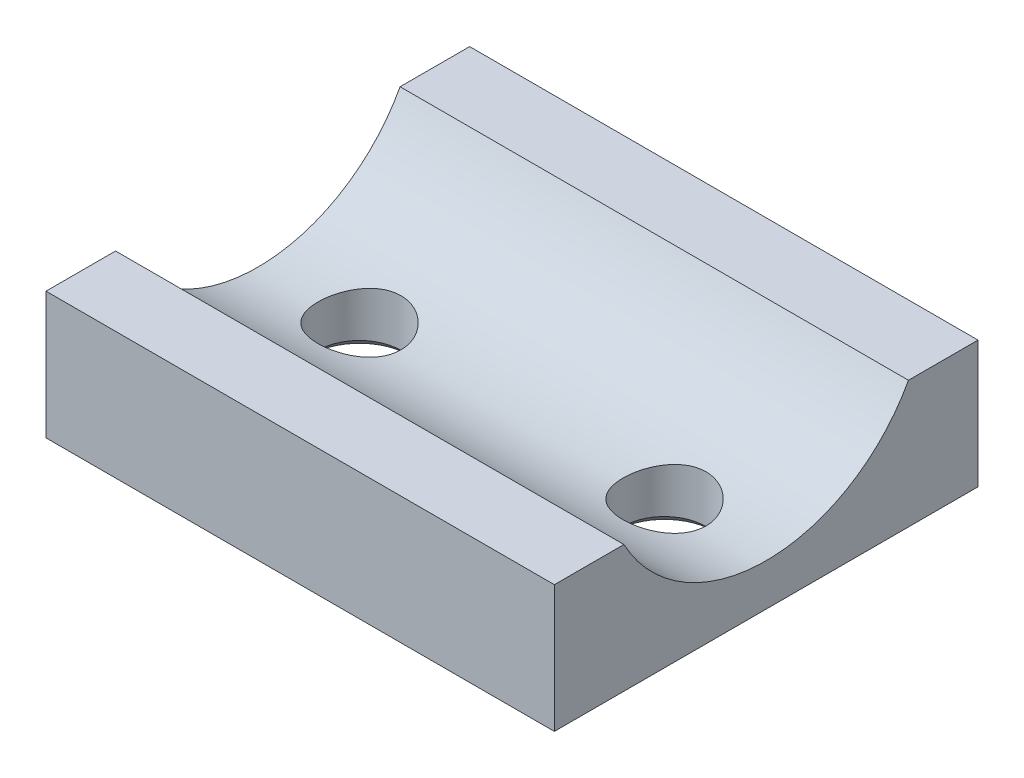
ISO-10303-21;
HEADER;
FILE_DESCRIPTION(('STEP AP214'),'2;1');
FILE_NAME('part.step','',(''),(''),'','','');
FILE_SCHEMA(('AUTOMOTIVE_DESIGN { 1 0 10303 214 1 1 1 1 }'));
ENDSEC;
DATA;
#1=APPLICATION_CONTEXT('core data for automotive mechanical design processes');
#2=APPLICATION_PROTOCOL_DEFINITION('international standard','automotive_design',2000,#1);
#3=PRODUCT_CONTEXT('',#1,'mechanical');
#4=PRODUCT('Part','Part','',(#3));
#5=PRODUCT_RELATED_PRODUCT_CATEGORY('part','',(#4));
#6=PRODUCT_DEFINITION_FORMATION('','',#4);
#7=PRODUCT_DEFINITION_CONTEXT('part definition',#1,'design');
#8=PRODUCT_DEFINITION('design','',#6,#7);
#9=PRODUCT_DEFINITION_SHAPE('','',#8);
#10=(LENGTH_UNIT() NAMED_UNIT(*) SI_UNIT(.MILLI.,.METRE.));
#11=(NAMED_UNIT(*) PLANE_ANGLE_UNIT() SI_UNIT($,.RADIAN.));
#12=(NAMED_UNIT(*) SI_UNIT($,.STERADIAN.) SOLID_ANGLE_UNIT());
#13=UNCERTAINTY_MEASURE_WITH_UNIT(LENGTH_MEASURE(1.E-05),#10,'distance_accuracy_value','');
#14=(GEOMETRIC_REPRESENTATION_CONTEXT(3) GLOBAL_UNCERTAINTY_ASSIGNED_CONTEXT((#13)) GLOBAL_UNIT_ASSIGNED_CONTEXT((#10,
#11,#12)) REPRESENTATION_CONTEXT('',''));
#15=CARTESIAN_POINT('',(0.,0.,0.));
#16=DIRECTION('',(0.,0.,1.));
#17=DIRECTION('',(1.,0.,0.));
#18=AXIS2_PLACEMENT_3D('',#15,#16,#17);
#19=CARTESIAN_POINT('',(15.,0.,0.));
#20=DIRECTION('',(-1.,0.,0.));
#21=DIRECTION('',(0.,0.,1.));
#22=AXIS2_PLACEMENT_3D('',#19,#20,#21);
#23=CYLINDRICAL_SURFACE('',#22,9.525);
#24=CARTESIAN_POINT('',(-9.,-9.20451655438785,-2.45));
#25=CARTESIAN_POINT('',(-9.13515200735814,-9.20451904732069,-2.44999639756066));
#26=CARTESIAN_POINT('',(-9.27034311682223,-9.20752577717406,-2.43877859758642));
#27=CARTESIAN_POINT('',(-9.53683369008053,-9.21919488490305,-2.39428105670851));
#28=CARTESIAN_POINT('',(-9.66813098166102,-9.22786035976253,-2.36098923472384));
#29=CARTESIAN_POINT('',(-9.92294057886931,-9.24980206611432,-2.27350009204487));
#30=CARTESIAN_POINT('',(-10.0464630576719,-9.26307211793909,-2.21933077968247));
#31=CARTESIAN_POINT('',(-10.282683007246,-9.29272000720761,-2.09171069647173));
#32=CARTESIAN_POINT('',(-10.3953798539359,-9.30909802365915,-2.01825881492206));
#33=CARTESIAN_POINT('',(-10.6093734683956,-9.34354353157542,-1.85233097698296));
#34=CARTESIAN_POINT('',(-10.7103809381502,-9.36163929153996,-1.75948771265328));
#35=CARTESIAN_POINT('',(-10.8955761840942,-9.39723665472627,-1.55820323633335));
#36=CARTESIAN_POINT('',(-10.9797623163948,-9.41473819973896,-1.44976050164231));
#37=CARTESIAN_POINT('',(-11.1301184529976,-9.44748908901226,-1.21836318732028));
#38=CARTESIAN_POINT('',(-11.1960028039258,-9.46270118954783,-1.09521726916934));
#39=CARTESIAN_POINT('',(-11.3060254502481,-9.48883590935607,-0.839140919265437));
#40=CARTESIAN_POINT('',(-11.3501671483797,-9.49975919977564,-0.706212022299402));
#41=CARTESIAN_POINT('',(-11.4145207200486,-9.51588568204961,-0.437360648249003));
#42=CARTESIAN_POINT('',(-11.4352242316497,-9.52120622318413,-0.301563013377123));
#43=CARTESIAN_POINT('',(-11.4536584722854,-9.52593723967559,-0.0283247085545592));
#44=CARTESIAN_POINT('',(-11.4513927886676,-9.5253486379274,0.109115701477194));
#45=CARTESIAN_POINT('',(-11.4243034086283,-9.51841445843529,0.378323148050841));
#46=CARTESIAN_POINT('',(-11.4000105967572,-9.51220437217914,0.510147623994009));
#47=CARTESIAN_POINT('',(-11.3304117185846,-9.49488365529906,0.767782232812577));
#48=CARTESIAN_POINT('',(-11.2851044982253,-9.48377275553656,0.893592034958776));
#49=CARTESIAN_POINT('',(-11.1743430677994,-9.45769425643134,1.13700616163227));
#50=CARTESIAN_POINT('',(-11.1087029333973,-9.44269128265499,1.25452193888615));
#51=CARTESIAN_POINT('',(-10.9592806892811,-9.41045144638833,1.4770543914048));
#52=CARTESIAN_POINT('',(-10.8754952596115,-9.39321417533165,1.58206877389471));
#53=CARTESIAN_POINT('',(-10.6893265684424,-9.35779777162174,1.77978485761155));
#54=CARTESIAN_POINT('',(-10.5864797460725,-9.3396058017549,1.87204825844288));
#55=CARTESIAN_POINT('',(-10.3665838077235,-9.30477899259357,2.03811997927798));
#56=CARTESIAN_POINT('',(-10.2495339459965,-9.28814423514372,2.11192732960103));
#57=CARTESIAN_POINT('',(-10.0036563466171,-9.25826690943316,2.23929479759944));
#58=CARTESIAN_POINT('',(-9.87476852402098,-9.24504310927628,2.29274363295592));
#59=CARTESIAN_POINT('',(-9.60941301845891,-9.22372227705825,2.37707490244969));
#60=CARTESIAN_POINT('',(-9.47294707375482,-9.21562407453326,2.40796248884444));
#61=CARTESIAN_POINT('',(-9.20038849045749,-9.20571859876108,2.44555522913943));
#62=CARTESIAN_POINT('',(-9.06439161804943,-9.20374214862286,2.45291089002456));
#63=CARTESIAN_POINT('',(-8.79311247410184,-9.20584244970522,2.44501672448147));
#64=CARTESIAN_POINT('',(-8.65783013376686,-9.2099186071091,2.42976911564301));
#65=CARTESIAN_POINT('',(-8.39427421048786,-9.22350217002365,2.37767295355934));
#66=CARTESIAN_POINT('',(-8.26591927515753,-9.23291296220525,2.34120834988184));
#67=CARTESIAN_POINT('',(-8.01714520757908,-9.25601257682629,2.24814154209332));
#68=CARTESIAN_POINT('',(-7.89672705934488,-9.2697019285239,2.19153684653124));
#69=CARTESIAN_POINT('',(-7.66450329863019,-9.30016859021987,2.05845258217061));
#70=CARTESIAN_POINT('',(-7.55292664794532,-9.31700378526459,1.98158703955528));
#71=CARTESIAN_POINT('',(-7.3440165644333,-9.35172572220855,1.81064694252776));
#72=CARTESIAN_POINT('',(-7.24668562087799,-9.36961264712177,1.71656938696293));
#73=CARTESIAN_POINT('',(-7.06636700069266,-9.4049998574581,1.51088033554449));
#74=CARTESIAN_POINT('',(-6.98383088333506,-9.42247712257714,1.39886825787311));
#75=CARTESIAN_POINT('',(-6.83873726429737,-9.45458400692376,1.16219853533747));
#76=CARTESIAN_POINT('',(-6.77617870748064,-9.46921377652897,1.0375415587857));
#77=CARTESIAN_POINT('',(-6.67337368879721,-9.49388389860037,0.779991865091784));
#78=CARTESIAN_POINT('',(-6.63296371065121,-9.50395778630622,0.647167783542031));
#79=CARTESIAN_POINT('',(-6.57511859051193,-9.5185282562603,0.376318792445267));
#80=CARTESIAN_POINT('',(-6.55767873644625,-9.52302598238662,0.23829495554935));
#81=CARTESIAN_POINT('',(-6.54654689215684,-9.52588754078064,-0.0348035575238239));
#82=CARTESIAN_POINT('',(-6.55219025193782,-9.5244230527255,-0.169849741223865));
#83=CARTESIAN_POINT('',(-6.585533386948,-9.51590865164056,-0.437001631212369));
#84=CARTESIAN_POINT('',(-6.61323243468107,-9.50885892283724,-0.569107434340114));
#85=CARTESIAN_POINT('',(-6.68953573573961,-9.48999595508919,-0.825888525303777));
#86=CARTESIAN_POINT('',(-6.738013524999,-9.47821155913753,-0.950603650238749));
#87=CARTESIAN_POINT('',(-6.85438442036358,-9.45111637079174,-1.1902009017017));
#88=CARTESIAN_POINT('',(-6.92228009594625,-9.43580511175663,-1.305081724287));
#89=CARTESIAN_POINT('',(-7.07755165206016,-9.4028212494833,-1.52487677432985));
#90=CARTESIAN_POINT('',(-7.16537415332756,-9.38509897890205,-1.62946803081194));
#91=CARTESIAN_POINT('',(-7.35714783165512,-9.34950412215302,-1.82265402050461));
#92=CARTESIAN_POINT('',(-7.46110315482277,-9.33163149846463,-1.91124462887626));
#93=CARTESIAN_POINT('',(-7.68470068019195,-9.29734946295689,-2.07166532226688));
#94=CARTESIAN_POINT('',(-7.80461566846157,-9.28097658367948,-2.14312364912729));
#95=CARTESIAN_POINT('',(-8.05516252579463,-9.25204932425484,-2.26476140553189));
#96=CARTESIAN_POINT('',(-8.18578685257367,-9.23949228555909,-2.31495565970033));
#97=CARTESIAN_POINT('',(-8.43006461288035,-9.2214884682937,-2.38554911143939));
#98=CARTESIAN_POINT('',(-8.54259436873599,-9.21517340347899,-2.40966381082372));
#99=CARTESIAN_POINT('',(-8.7700734733828,-9.20668658663812,-2.44189001297891));
#100=CARTESIAN_POINT('',(-8.88502258689412,-9.20451443358347,-2.45000306469112));
#101=CARTESIAN_POINT('',(-9.,-9.20451655438785,-2.45));
#102=B_SPLINE_CURVE_WITH_KNOTS('',3,(#24,#25,#26,#27,#28,#29,#30,#31,#32,#33,#34,#35,#36,#37,
#38,#39,#40,#41,#42,#43,#44,#45,#46,#47,#48,#49,#50,#51,#52,#53,#54,#55,#56,#57,#58,#59,#60,#61,
#62,#63,#64,#65,#66,#67,#68,#69,#70,#71,#72,#73,#74,#75,#76,#77,#78,#79,#80,#81,#82,#83,#84,#85,
#86,#87,#88,#89,#90,#91,#92,#93,#94,#95,#96,#97,#98,#99,#100,#101),.UNSPECIFIED.,.T.,.F.,(4,2,2,
2,2,2,2,2,2,2,2,2,2,2,2,2,2,2,2,2,2,2,2,2,2,2,2,2,2,2,2,2,2,2,2,2,2,2,4),(0.,0.405033556223293,
0.810288969917497,1.21500259247304,1.61973953218229,2.03298089055452,2.44626261378845,
2.86567248361529,3.28501669468742,3.69539160187489,4.10570241736427,4.50637961800963,
4.9070788254332,5.31155594436278,5.71610713109936,6.13223422616177,6.54838317994662,
6.9667752848948,7.38507181275935,7.79170046892841,8.19828923370652,8.59773948761769,
8.99723917312922,9.40498158411839,9.81279515851361,10.2314808186321,10.6501443617521,
11.0656739123877,11.4811182083494,11.8846857974122,12.288240075546,12.6893723502764,
13.090557729531,13.5018239099378,13.9131959606152,14.3328179654186,14.7521469399544,
15.0967531354444,15.441325971808),.UNSPECIFIED.);
#103=CARTESIAN_POINT('',(-9.,-9.20451655438785,-2.45));
#104=VERTEX_POINT('',#103);
#105=EDGE_CURVE('E156',#104,#104,#102,.T.);
#106=ORIENTED_EDGE('',*,*,#105,.F.);
#107=EDGE_LOOP('',(#106));
#108=FACE_BOUND('',#107,.T.);
#109=CARTESIAN_POINT('',(9.,-9.20451655438785,-2.45));
#110=CARTESIAN_POINT('',(8.86484799264186,-9.20451904732069,-2.44999639756066));
#111=CARTESIAN_POINT('',(8.72965688317776,-9.20752577717406,-2.43877859758642));
#112=CARTESIAN_POINT('',(8.46316630991946,-9.21919488490305,-2.39428105670851));
#113=CARTESIAN_POINT('',(8.33186901833897,-9.22786035976253,-2.36098923472384));
#114=CARTESIAN_POINT('',(8.07705942113069,-9.24980206611432,-2.27350009204487));
#115=CARTESIAN_POINT('',(7.95353694232808,-9.26307211793909,-2.21933077968247));
#116=CARTESIAN_POINT('',(7.717316992754,-9.29272000720761,-2.09171069647173));
#117=CARTESIAN_POINT('',(7.60462014606409,-9.30909802365915,-2.01825881492206));
#118=CARTESIAN_POINT('',(7.39062653160443,-9.34354353157542,-1.85233097698296));
#119=CARTESIAN_POINT('',(7.28961906184985,-9.36163929153996,-1.75948771265328));
#120=CARTESIAN_POINT('',(7.10442381590581,-9.39723665472627,-1.55820323633335));
#121=CARTESIAN_POINT('',(7.0202376836052,-9.41473819973896,-1.44976050164231));
#122=CARTESIAN_POINT('',(6.8698815470024,-9.44748908901226,-1.21836318732028));
#123=CARTESIAN_POINT('',(6.80399719607419,-9.46270118954783,-1.09521726916934));
#124=CARTESIAN_POINT('',(6.69397454975189,-9.48883590935607,-0.839140919265437));
#125=CARTESIAN_POINT('',(6.64983285162027,-9.49975919977564,-0.706212022299402));
#126=CARTESIAN_POINT('',(6.58547927995137,-9.51588568204961,-0.437360648249003));
#127=CARTESIAN_POINT('',(6.56477576835034,-9.52120622318413,-0.301563013377124));
#128=CARTESIAN_POINT('',(6.54634152771462,-9.52593723967559,-0.0283247085545598));
#129=CARTESIAN_POINT('',(6.54860721133242,-9.5253486379274,0.109115701477194));
#130=CARTESIAN_POINT('',(6.57569659137167,-9.51841445843529,0.37832314805084));
#131=CARTESIAN_POINT('',(6.59998940324282,-9.51220437217914,0.510147623994008));
#132=CARTESIAN_POINT('',(6.66958828141544,-9.49488365529906,0.767782232812575));
#133=CARTESIAN_POINT('',(6.71489550177474,-9.48377275553656,0.893592034958775));
#134=CARTESIAN_POINT('',(6.82565693220063,-9.45769425643134,1.13700616163227));
#135=CARTESIAN_POINT('',(6.8912970666027,-9.44269128265499,1.25452193888615));
#136=CARTESIAN_POINT('',(7.04071931071889,-9.41045144638833,1.4770543914048));
#137=CARTESIAN_POINT('',(7.12450474038848,-9.39321417533165,1.58206877389471));
#138=CARTESIAN_POINT('',(7.31067343155756,-9.35779777162174,1.77978485761155));
#139=CARTESIAN_POINT('',(7.41352025392751,-9.3396058017549,1.87204825844288));
#140=CARTESIAN_POINT('',(7.63341619227654,-9.30477899259357,2.03811997927798));
#141=CARTESIAN_POINT('',(7.7504660540035,-9.28814423514372,2.11192732960103));
#142=CARTESIAN_POINT('',(7.99634365338286,-9.25826690943316,2.23929479759944));
#143=CARTESIAN_POINT('',(8.12523147597902,-9.24504310927628,2.29274363295592));
#144=CARTESIAN_POINT('',(8.39058698154109,-9.22372227705825,2.3770749024497));
#145=CARTESIAN_POINT('',(8.52705292624518,-9.21562407453326,2.40796248884444));
#146=CARTESIAN_POINT('',(8.7996115095425,-9.20571859876108,2.44555522913943));
#147=CARTESIAN_POINT('',(8.93560838195057,-9.20374214862286,2.45291089002456));
#148=CARTESIAN_POINT('',(9.20688752589816,-9.20584244970522,2.44501672448147));
#149=CARTESIAN_POINT('',(9.34216986623314,-9.2099186071091,2.42976911564301));
#150=CARTESIAN_POINT('',(9.60572578951213,-9.22350217002365,2.37767295355934));
#151=CARTESIAN_POINT('',(9.73408072484246,-9.23291296220525,2.34120834988184));
#152=CARTESIAN_POINT('',(9.98285479242092,-9.25601257682629,2.24814154209332));
#153=CARTESIAN_POINT('',(10.1032729406551,-9.2697019285239,2.19153684653124));
#154=CARTESIAN_POINT('',(10.3354967013698,-9.30016859021987,2.05845258217061));
#155=CARTESIAN_POINT('',(10.4470733520547,-9.31700378526459,1.98158703955528));
#156=CARTESIAN_POINT('',(10.6559834355667,-9.35172572220855,1.81064694252776));
#157=CARTESIAN_POINT('',(10.753314379122,-9.36961264712177,1.71656938696293));
#158=CARTESIAN_POINT('',(10.9336329993073,-9.4049998574581,1.51088033554449));
#159=CARTESIAN_POINT('',(11.0161691166649,-9.42247712257714,1.39886825787311));
#160=CARTESIAN_POINT('',(11.1612627357026,-9.45458400692376,1.16219853533747));
#161=CARTESIAN_POINT('',(11.2238212925194,-9.46921377652897,1.0375415587857));
#162=CARTESIAN_POINT('',(11.3266263112028,-9.49388389860037,0.779991865091783));
#163=CARTESIAN_POINT('',(11.3670362893488,-9.50395778630622,0.647167783542029));
#164=CARTESIAN_POINT('',(11.4248814094881,-9.5185282562603,0.376318792445264));
#165=CARTESIAN_POINT('',(11.4423212635537,-9.52302598238662,0.238294955549349));
#166=CARTESIAN_POINT('',(11.4534531078432,-9.52588754078064,-0.0348035575238246));
#167=CARTESIAN_POINT('',(11.4478097480622,-9.5244230527255,-0.169849741223866));
#168=CARTESIAN_POINT('',(11.414466613052,-9.51590865164056,-0.437001631212369));
#169=CARTESIAN_POINT('',(11.3867675653189,-9.50885892283724,-0.569107434340114));
#170=CARTESIAN_POINT('',(11.3104642642604,-9.48999595508919,-0.825888525303778));
#171=CARTESIAN_POINT('',(11.261986475001,-9.47821155913753,-0.950603650238749));
#172=CARTESIAN_POINT('',(11.1456155796364,-9.45111637079174,-1.1902009017017));
#173=CARTESIAN_POINT('',(11.0777199040538,-9.43580511175663,-1.305081724287));
#174=CARTESIAN_POINT('',(10.9224483479398,-9.4028212494833,-1.52487677432986));
#175=CARTESIAN_POINT('',(10.8346258466724,-9.38509897890205,-1.62946803081195));
#176=CARTESIAN_POINT('',(10.6428521683449,-9.34950412215302,-1.82265402050461));
#177=CARTESIAN_POINT('',(10.5388968451772,-9.33163149846463,-1.91124462887626));
#178=CARTESIAN_POINT('',(10.315299319808,-9.29734946295689,-2.07166532226689));
#179=CARTESIAN_POINT('',(10.1953843315384,-9.28097658367948,-2.14312364912729));
#180=CARTESIAN_POINT('',(9.94483747420536,-9.25204932425484,-2.26476140553189));
#181=CARTESIAN_POINT('',(9.81421314742633,-9.23949228555909,-2.31495565970033));
#182=CARTESIAN_POINT('',(9.56993538711965,-9.2214884682937,-2.38554911143939));
#183=CARTESIAN_POINT('',(9.45740563126401,-9.21517340347899,-2.40966381082372));
#184=CARTESIAN_POINT('',(9.2299265266172,-9.20668658663812,-2.44189001297891));
#185=CARTESIAN_POINT('',(9.11497741310588,-9.20451443358347,-2.45000306469112));
#186=CARTESIAN_POINT('',(9.,-9.20451655438785,-2.45));
#187=B_SPLINE_CURVE_WITH_KNOTS('',3,(#109,#110,#111,#112,#113,#114,#115,#116,#117,#118,#119,
#120,#121,#122,#123,#124,#125,#126,#127,#128,#129,#130,#131,#132,#133,#134,#135,#136,#137,#138,
#139,#140,#141,#142,#143,#144,#145,#146,#147,#148,#149,#150,#151,#152,#153,#154,#155,#156,#157,
#158,#159,#160,#161,#162,#163,#164,#165,#166,#167,#168,#169,#170,#171,#172,#173,#174,#175,#176,
#177,#178,#179,#180,#181,#182,#183,#184,#185,#186),.UNSPECIFIED.,.T.,.F.,(4,2,2,2,2,2,2,2,2,2,2,
2,2,2,2,2,2,2,2,2,2,2,2,2,2,2,2,2,2,2,2,2,2,2,2,2,2,2,4),(0.,0.405033556223293,
0.810288969917497,1.21500259247304,1.61973953218229,2.03298089055452,2.44626261378845,
2.86567248361529,3.28501669468742,3.69539160187489,4.10570241736427,4.50637961800963,
4.9070788254332,5.31155594436278,5.71610713109936,6.13223422616178,6.54838317994662,
6.9667752848948,7.38507181275936,7.79170046892841,8.19828923370652,8.59773948761769,
8.99723917312922,9.40498158411839,9.81279515851361,10.2314808186321,10.6501443617521,
11.0656739123877,11.4811182083494,11.8846857974122,12.288240075546,12.6893723502764,
13.090557729531,13.5018239099378,13.9131959606153,14.3328179654186,14.7521469399544,
15.0967531354444,15.441325971808),.UNSPECIFIED.);
#188=CARTESIAN_POINT('',(9.,-9.20451655438785,-2.45));
#189=VERTEX_POINT('',#188);
#190=EDGE_CURVE('E217',#189,#189,#187,.T.);
#191=ORIENTED_EDGE('',*,*,#190,.F.);
#192=EDGE_LOOP('',(#191));
#193=FACE_BOUND('',#192,.T.);
#194=CARTESIAN_POINT('',(-15.,0.,0.));
#195=DIRECTION('',(1.,0.,0.));
#196=DIRECTION('',(0.,0.,-1.));
#197=AXIS2_PLACEMENT_3D('',#194,#195,#196);
#198=CIRCLE('',#197,9.525);
#199=CARTESIAN_POINT('',(-15.,-4.5,8.39497617626161));
#200=VERTEX_POINT('',#199);
#201=CARTESIAN_POINT('',(-15.,-4.5,-8.39497617626161));
#202=VERTEX_POINT('',#201);
#203=EDGE_CURVE('E116',#200,#202,#198,.T.);
#204=ORIENTED_EDGE('',*,*,#203,.F.);
#205=DIRECTION('',(-1.,0.,0.));
#206=VECTOR('',#205,1.);
#207=CARTESIAN_POINT('',(15.,-4.5,8.39497617626161));
#208=LINE('',#207,#206);
#209=CARTESIAN_POINT('',(15.,-4.5,8.39497617626161));
#210=VERTEX_POINT('',#209);
#211=EDGE_CURVE('E111',#210,#200,#208,.T.);
#212=ORIENTED_EDGE('',*,*,#211,.F.);
#213=CARTESIAN_POINT('',(15.,0.,0.));
#214=DIRECTION('',(1.,0.,0.));
#215=DIRECTION('',(0.,0.,-1.));
#216=AXIS2_PLACEMENT_3D('',#213,#214,#215);
#217=CIRCLE('',#216,9.525);
#218=CARTESIAN_POINT('',(15.,-4.5,-8.39497617626161));
#219=VERTEX_POINT('',#218);
#220=EDGE_CURVE('E113',#210,#219,#217,.T.);
#221=ORIENTED_EDGE('',*,*,#220,.T.);
#222=DIRECTION('',(-1.,0.,0.));
#223=VECTOR('',#222,1.);
#224=CARTESIAN_POINT('',(15.,-4.5,-8.39497617626161));
#225=LINE('',#224,#223);
#226=EDGE_CURVE('E143',#219,#202,#225,.T.);
#227=ORIENTED_EDGE('',*,*,#226,.T.);
#228=EDGE_LOOP('',(#204,#212,#221,#227));
#229=FACE_BOUND('',#228,.T.);
#230=ADVANCED_FACE('F41',(#108,#193,#229),#23,.F.);
#231=CARTESIAN_POINT('',(15.,-4.5,0.));
#232=DIRECTION('',(0.,1.,0.));
#233=DIRECTION('',(0.,0.,1.));
#234=AXIS2_PLACEMENT_3D('',#231,#232,#233);
#235=PLANE('',#234);
#236=DIRECTION('',(0.,0.,-1.));
#237=VECTOR('',#236,1.);
#238=CARTESIAN_POINT('',(-15.,-4.5,0.));
#239=LINE('',#238,#237);
#240=CARTESIAN_POINT('',(-15.,-4.5,12.5));
#241=VERTEX_POINT('',#240);
#242=EDGE_CURVE('E155',#241,#200,#239,.T.);
#243=ORIENTED_EDGE('',*,*,#242,.F.);
#244=DIRECTION('',(-1.,0.,0.));
#245=VECTOR('',#244,1.);
#246=CARTESIAN_POINT('',(15.,-4.5,12.5));
#247=LINE('',#246,#245);
#248=CARTESIAN_POINT('',(15.,-4.5,12.5));
#249=VERTEX_POINT('',#248);
#250=EDGE_CURVE('E123',#249,#241,#247,.T.);
#251=ORIENTED_EDGE('',*,*,#250,.F.);
#252=DIRECTION('',(0.,0.,-1.));
#253=VECTOR('',#252,1.);
#254=CARTESIAN_POINT('',(15.,-4.5,0.));
#255=LINE('',#254,#253);
#256=EDGE_CURVE('E127',#249,#210,#255,.T.);
#257=ORIENTED_EDGE('',*,*,#256,.T.);
#258=ORIENTED_EDGE('',*,*,#211,.T.);
#259=EDGE_LOOP('',(#243,#251,#257,#258));
#260=FACE_BOUND('',#259,.T.);
#261=ADVANCED_FACE('F134',(#260),#235,.T.);
#262=CARTESIAN_POINT('',(15.,0.,12.5));
#263=DIRECTION('',(0.,0.,1.));
#264=DIRECTION('',(1.,0.,0.));
#265=AXIS2_PLACEMENT_3D('',#262,#263,#264);
#266=PLANE('',#265);
#267=DIRECTION('',(0.,1.,0.));
#268=VECTOR('',#267,1.);
#269=CARTESIAN_POINT('',(-15.,0.,12.5));
#270=LINE('',#269,#268);
#271=CARTESIAN_POINT('',(-15.,-12.,12.5));
#272=VERTEX_POINT('',#271);
#273=EDGE_CURVE('E159',#272,#241,#270,.T.);
#274=ORIENTED_EDGE('',*,*,#273,.F.);
#275=DIRECTION('',(1.,0.,0.));
#276=VECTOR('',#275,1.);
#277=CARTESIAN_POINT('',(15.,-12.,12.5));
#278=LINE('',#277,#276);
#279=CARTESIAN_POINT('',(15.,-12.,12.5));
#280=VERTEX_POINT('',#279);
#281=EDGE_CURVE('E189',#272,#280,#278,.T.);
#282=ORIENTED_EDGE('',*,*,#281,.T.);
#283=DIRECTION('',(0.,1.,0.));
#284=VECTOR('',#283,1.);
#285=CARTESIAN_POINT('',(15.,0.,12.5));
#286=LINE('',#285,#284);
#287=EDGE_CURVE('E137',#280,#249,#286,.T.);
#288=ORIENTED_EDGE('',*,*,#287,.T.);
#289=ORIENTED_EDGE('',*,*,#250,.T.);
#290=EDGE_LOOP('',(#274,#282,#288,#289));
#291=FACE_BOUND('',#290,.T.);
#292=ADVANCED_FACE('F262',(#291),#266,.T.);
#293=CARTESIAN_POINT('',(15.,-12.5,0.));
#294=DIRECTION('',(0.,-1.,0.));
#295=DIRECTION('',(0.,0.,-1.));
#296=AXIS2_PLACEMENT_3D('',#293,#294,#295);
#297=PLANE('',#296);
#298=DIRECTION('',(0.,0.,1.));
#299=VECTOR('',#298,1.);
#300=CARTESIAN_POINT('',(14.5,-12.5,0.));
#301=LINE('',#300,#299);
#302=CARTESIAN_POINT('',(14.5,-12.5,-12.));
#303=VERTEX_POINT('',#302);
#304=CARTESIAN_POINT('',(14.5,-12.5,12.));
#305=VERTEX_POINT('',#304);
#306=EDGE_CURVE('E182',#303,#305,#301,.T.);
#307=ORIENTED_EDGE('',*,*,#306,.T.);
#308=DIRECTION('',(-1.,0.,0.));
#309=VECTOR('',#308,1.);
#310=CARTESIAN_POINT('',(15.,-12.5,12.));
#311=LINE('',#310,#309);
#312=CARTESIAN_POINT('',(-14.5,-12.5,12.));
#313=VERTEX_POINT('',#312);
#314=EDGE_CURVE('E185',#305,#313,#311,.T.);
#315=ORIENTED_EDGE('',*,*,#314,.T.);
#316=DIRECTION('',(0.,0.,-1.));
#317=VECTOR('',#316,1.);
#318=CARTESIAN_POINT('',(-14.5,-12.5,-12.5));
#319=LINE('',#318,#317);
#320=CARTESIAN_POINT('',(-14.5,-12.5,-12.));
#321=VERTEX_POINT('',#320);
#322=EDGE_CURVE('E176',#313,#321,#319,.T.);
#323=ORIENTED_EDGE('',*,*,#322,.T.);
#324=DIRECTION('',(1.,0.,0.));
#325=VECTOR('',#324,1.);
#326=CARTESIAN_POINT('',(15.,-12.5,-12.));
#327=LINE('',#326,#325);
#328=EDGE_CURVE('E179',#321,#303,#327,.T.);
#329=ORIENTED_EDGE('',*,*,#328,.T.);
#330=EDGE_LOOP('',(#307,#315,#323,#329));
#331=FACE_BOUND('',#330,.T.);
#332=CARTESIAN_POINT('',(9.,-12.5,0.));
#333=DIRECTION('',(0.,-1.,0.));
#334=DIRECTION('',(0.,0.,-1.));
#335=AXIS2_PLACEMENT_3D('',#332,#333,#334);
#336=CIRCLE('',#335,2.95000000000001);
#337=CARTESIAN_POINT('',(9.,-12.5,-2.95000000000001));
#338=VERTEX_POINT('',#337);
#339=EDGE_CURVE('E172',#338,#338,#336,.F.);
#340=ORIENTED_EDGE('',*,*,#339,.T.);
#341=EDGE_LOOP('',(#340));
#342=FACE_BOUND('',#341,.T.);
#343=CARTESIAN_POINT('',(-9.,-12.5,0.));
#344=DIRECTION('',(0.,-1.,0.));
#345=DIRECTION('',(0.,0.,-1.));
#346=AXIS2_PLACEMENT_3D('',#343,#344,#345);
#347=CIRCLE('',#346,2.95000000000001);
#348=CARTESIAN_POINT('',(-9.,-12.5,-2.95000000000001));
#349=VERTEX_POINT('',#348);
#350=EDGE_CURVE('E122',#349,#349,#347,.F.);
#351=ORIENTED_EDGE('',*,*,#350,.T.);
#352=EDGE_LOOP('',(#351));
#353=FACE_BOUND('',#352,.T.);
#354=ADVANCED_FACE('F260',(#331,#342,#353),#297,.T.);
#355=CARTESIAN_POINT('',(15.,0.,-12.5));
#356=DIRECTION('',(0.,0.,1.));
#357=DIRECTION('',(0.,-1.,0.));
#358=AXIS2_PLACEMENT_3D('',#355,#356,#357);
#359=PLANE('',#358);
#360=DIRECTION('',(0.,1.,0.));
#361=VECTOR('',#360,1.);
#362=CARTESIAN_POINT('',(15.,0.,-12.5));
#363=LINE('',#362,#361);
#364=CARTESIAN_POINT('',(15.,-12.,-12.5));
#365=VERTEX_POINT('',#364);
#366=CARTESIAN_POINT('',(15.,-4.5,-12.5));
#367=VERTEX_POINT('',#366);
#368=EDGE_CURVE('E140',#365,#367,#363,.T.);
#369=ORIENTED_EDGE('',*,*,#368,.F.);
#370=DIRECTION('',(-1.,0.,0.));
#371=VECTOR('',#370,1.);
#372=CARTESIAN_POINT('',(-15.,-12.,-12.5));
#373=LINE('',#372,#371);
#374=CARTESIAN_POINT('',(-15.,-12.,-12.5));
#375=VERTEX_POINT('',#374);
#376=EDGE_CURVE('E60',#365,#375,#373,.T.);
#377=ORIENTED_EDGE('',*,*,#376,.T.);
#378=DIRECTION('',(0.,1.,0.));
#379=VECTOR('',#378,1.);
#380=CARTESIAN_POINT('',(-15.,0.,-12.5));
#381=LINE('',#380,#379);
#382=CARTESIAN_POINT('',(-15.,-4.5,-12.5));
#383=VERTEX_POINT('',#382);
#384=EDGE_CURVE('E162',#375,#383,#381,.T.);
#385=ORIENTED_EDGE('',*,*,#384,.T.);
#386=DIRECTION('',(-1.,0.,0.));
#387=VECTOR('',#386,1.);
#388=CARTESIAN_POINT('',(15.,-4.5,-12.5));
#389=LINE('',#388,#387);
#390=EDGE_CURVE('E148',#367,#383,#389,.T.);
#391=ORIENTED_EDGE('',*,*,#390,.F.);
#392=EDGE_LOOP('',(#369,#377,#385,#391));
#393=FACE_BOUND('',#392,.T.);
#394=ADVANCED_FACE('F257',(#393),#359,.F.);
#395=EDGE_CURVE('E131',#202,#383,#239,.T.);
#396=ORIENTED_EDGE('',*,*,#395,.F.);
#397=ORIENTED_EDGE('',*,*,#226,.F.);
#398=EDGE_CURVE('E129',#219,#367,#255,.T.);
#399=ORIENTED_EDGE('',*,*,#398,.T.);
#400=ORIENTED_EDGE('',*,*,#390,.T.);
#401=EDGE_LOOP('',(#396,#397,#399,#400));
#402=FACE_BOUND('',#401,.T.);
#403=ADVANCED_FACE('F251',(#402),#235,.T.);
#404=CARTESIAN_POINT('',(15.,0.,0.));
#405=DIRECTION('',(1.,0.,0.));
#406=DIRECTION('',(0.,0.,-1.));
#407=AXIS2_PLACEMENT_3D('',#404,#405,#406);
#408=PLANE('',#407);
#409=ORIENTED_EDGE('',*,*,#287,.F.);
#410=DIRECTION('',(0.,0.,-1.));
#411=VECTOR('',#410,1.);
#412=CARTESIAN_POINT('',(15.,-12.,0.));
#413=LINE('',#412,#411);
#414=EDGE_CURVE('E68',#280,#365,#413,.T.);
#415=ORIENTED_EDGE('',*,*,#414,.T.);
#416=ORIENTED_EDGE('',*,*,#368,.T.);
#417=ORIENTED_EDGE('',*,*,#398,.F.);
#418=ORIENTED_EDGE('',*,*,#220,.F.);
#419=ORIENTED_EDGE('',*,*,#256,.F.);
#420=EDGE_LOOP('',(#409,#415,#416,#417,#418,#419));
#421=FACE_BOUND('',#420,.T.);
#422=ADVANCED_FACE('F126',(#421),#408,.T.);
#423=CARTESIAN_POINT('',(-15.,0.,0.));
#424=DIRECTION('',(1.,0.,0.));
#425=DIRECTION('',(0.,0.,-1.));
#426=AXIS2_PLACEMENT_3D('',#423,#424,#425);
#427=PLANE('',#426);
#428=ORIENTED_EDGE('',*,*,#384,.F.);
#429=DIRECTION('',(0.,0.,1.));
#430=VECTOR('',#429,1.);
#431=CARTESIAN_POINT('',(-15.,-12.,12.5));
#432=LINE('',#431,#430);
#433=EDGE_CURVE('E197',#375,#272,#432,.T.);
#434=ORIENTED_EDGE('',*,*,#433,.T.);
#435=ORIENTED_EDGE('',*,*,#273,.T.);
#436=ORIENTED_EDGE('',*,*,#242,.T.);
#437=ORIENTED_EDGE('',*,*,#203,.T.);
#438=ORIENTED_EDGE('',*,*,#395,.T.);
#439=EDGE_LOOP('',(#428,#434,#435,#436,#437,#438));
#440=FACE_BOUND('',#439,.T.);
#441=ADVANCED_FACE('F246',(#440),#427,.F.);
#442=CARTESIAN_POINT('',(9.,-4.5,0.));
#443=DIRECTION('',(0.,-1.,0.));
#444=DIRECTION('',(0.,0.,-1.));
#445=AXIS2_PLACEMENT_3D('',#442,#443,#444);
#446=CYLINDRICAL_SURFACE('',#445,2.45);
#447=CARTESIAN_POINT('',(9.,-12.,0.));
#448=DIRECTION('',(0.,-1.,0.));
#449=DIRECTION('',(0.,0.,-1.));
#450=AXIS2_PLACEMENT_3D('',#447,#448,#449);
#451=CIRCLE('',#450,2.45);
#452=CARTESIAN_POINT('',(9.,-12.,-2.45));
#453=VERTEX_POINT('',#452);
#454=EDGE_CURVE('E52',#453,#453,#451,.T.);
#455=ORIENTED_EDGE('',*,*,#454,.T.);
#456=EDGE_LOOP('',(#455));
#457=FACE_BOUND('',#456,.T.);
#458=ORIENTED_EDGE('',*,*,#190,.T.);
#459=EDGE_LOOP('',(#458));
#460=FACE_BOUND('',#459,.T.);
#461=ADVANCED_FACE('F241',(#457,#460),#446,.F.);
#462=CARTESIAN_POINT('',(-9.,-4.5,0.));
#463=DIRECTION('',(0.,-1.,0.));
#464=DIRECTION('',(0.,0.,-1.));
#465=AXIS2_PLACEMENT_3D('',#462,#463,#464);
#466=CYLINDRICAL_SURFACE('',#465,2.45);
#467=CARTESIAN_POINT('',(-9.,-12.,0.));
#468=DIRECTION('',(0.,-1.,0.));
#469=DIRECTION('',(0.,0.,-1.));
#470=AXIS2_PLACEMENT_3D('',#467,#468,#469);
#471=CIRCLE('',#470,2.45);
#472=CARTESIAN_POINT('',(-9.,-12.,-2.45));
#473=VERTEX_POINT('',#472);
#474=EDGE_CURVE('E11',#473,#473,#471,.T.);
#475=ORIENTED_EDGE('',*,*,#474,.T.);
#476=EDGE_LOOP('',(#475));
#477=FACE_BOUND('',#476,.T.);
#478=ORIENTED_EDGE('',*,*,#105,.T.);
#479=EDGE_LOOP('',(#478));
#480=FACE_BOUND('',#479,.T.);
#481=ADVANCED_FACE('F245',(#477,#480),#466,.F.);
#482=CARTESIAN_POINT('',(15.,-12.,-12.5));
#483=DIRECTION('',(0.,-0.707106781186546,-0.707106781186549));
#484=DIRECTION('',(1.,0.,0.));
#485=AXIS2_PLACEMENT_3D('',#482,#483,#484);
#486=PLANE('',#485);
#487=DIRECTION('',(0.577350269189626,-0.577350269189626,0.577350269189624));
#488=VECTOR('',#487,1.);
#489=CARTESIAN_POINT('',(-10.8333333333333,-16.1666666666667,-8.33333333333335));
#490=LINE('',#489,#488);
#491=EDGE_CURVE('E208',#375,#321,#490,.T.);
#492=ORIENTED_EDGE('',*,*,#491,.F.);
#493=ORIENTED_EDGE('',*,*,#376,.F.);
#494=DIRECTION('',(0.577350269189626,0.577350269189626,-0.577350269189624));
#495=VECTOR('',#494,1.);
#496=CARTESIAN_POINT('',(15.,-12.,-12.5));
#497=LINE('',#496,#495);
#498=EDGE_CURVE('E46',#303,#365,#497,.T.);
#499=ORIENTED_EDGE('',*,*,#498,.F.);
#500=ORIENTED_EDGE('',*,*,#328,.F.);
#501=EDGE_LOOP('',(#492,#493,#499,#500));
#502=FACE_BOUND('',#501,.T.);
#503=ADVANCED_FACE('F278',(#502),#486,.T.);
#504=CARTESIAN_POINT('',(14.5,-12.5,0.));
#505=DIRECTION('',(-0.707106781186547,0.707106781186547,0.));
#506=DIRECTION('',(0.,0.,1.));
#507=AXIS2_PLACEMENT_3D('',#504,#505,#506);
#508=PLANE('',#507);
#509=ORIENTED_EDGE('',*,*,#498,.T.);
#510=ORIENTED_EDGE('',*,*,#414,.F.);
#511=DIRECTION('',(-0.577350269189626,-0.577350269189626,-0.577350269189626));
#512=VECTOR('',#511,1.);
#513=CARTESIAN_POINT('',(10.5,-16.5,8.));
#514=LINE('',#513,#512);
#515=EDGE_CURVE('E206',#305,#280,#514,.F.);
#516=ORIENTED_EDGE('',*,*,#515,.F.);
#517=ORIENTED_EDGE('',*,*,#306,.F.);
#518=EDGE_LOOP('',(#509,#510,#516,#517));
#519=FACE_BOUND('',#518,.T.);
#520=ADVANCED_FACE('F283',(#519),#508,.F.);
#521=CARTESIAN_POINT('',(-15.,-12.,0.));
#522=DIRECTION('',(-0.707106781186547,-0.707106781186547,0.));
#523=DIRECTION('',(0.,0.,-1.));
#524=AXIS2_PLACEMENT_3D('',#521,#522,#523);
#525=PLANE('',#524);
#526=ORIENTED_EDGE('',*,*,#491,.T.);
#527=ORIENTED_EDGE('',*,*,#322,.F.);
#528=DIRECTION('',(0.577350269189626,-0.577350269189626,-0.577350269189626));
#529=VECTOR('',#528,1.);
#530=CARTESIAN_POINT('',(-10.8333333333333,-16.1666666666667,8.33333333333333));
#531=LINE('',#530,#529);
#532=EDGE_CURVE('E203',#272,#313,#531,.T.);
#533=ORIENTED_EDGE('',*,*,#532,.F.);
#534=ORIENTED_EDGE('',*,*,#433,.F.);
#535=EDGE_LOOP('',(#526,#527,#533,#534));
#536=FACE_BOUND('',#535,.T.);
#537=ADVANCED_FACE('F301',(#536),#525,.T.);
#538=CARTESIAN_POINT('',(15.,-12.5,12.));
#539=DIRECTION('',(0.,0.707106781186547,-0.707106781186547));
#540=DIRECTION('',(-1.,0.,0.));
#541=AXIS2_PLACEMENT_3D('',#538,#539,#540);
#542=PLANE('',#541);
#543=ORIENTED_EDGE('',*,*,#515,.T.);
#544=ORIENTED_EDGE('',*,*,#281,.F.);
#545=ORIENTED_EDGE('',*,*,#532,.T.);
#546=ORIENTED_EDGE('',*,*,#314,.F.);
#547=EDGE_LOOP('',(#543,#544,#545,#546));
#548=FACE_BOUND('',#547,.T.);
#549=ADVANCED_FACE('F294',(#548),#542,.F.);
#550=CARTESIAN_POINT('',(9.,-12.,0.));
#551=DIRECTION('',(0.,-1.,0.));
#552=DIRECTION('',(0.,0.,-1.));
#553=AXIS2_PLACEMENT_3D('',#550,#551,#552);
#554=CONICAL_SURFACE('',#553,2.45,0.785398163397447);
#555=ORIENTED_EDGE('',*,*,#339,.F.);
#556=EDGE_LOOP('',(#555));
#557=FACE_BOUND('',#556,.T.);
#558=ORIENTED_EDGE('',*,*,#454,.F.);
#559=EDGE_LOOP('',(#558));
#560=FACE_BOUND('',#559,.T.);
#561=ADVANCED_FACE('F289',(#557,#560),#554,.F.);
#562=CARTESIAN_POINT('',(-9.,-12.,0.));
#563=DIRECTION('',(0.,-1.,0.));
#564=DIRECTION('',(0.,0.,-1.));
#565=AXIS2_PLACEMENT_3D('',#562,#563,#564);
#566=CONICAL_SURFACE('',#565,2.45,0.785398163397447);
#567=ORIENTED_EDGE('',*,*,#350,.F.);
#568=EDGE_LOOP('',(#567));
#569=FACE_BOUND('',#568,.T.);
#570=ORIENTED_EDGE('',*,*,#474,.F.);
#571=EDGE_LOOP('',(#570));
#572=FACE_BOUND('',#571,.T.);
#573=ADVANCED_FACE('F44',(#569,#572),#566,.F.);
#574=CLOSED_SHELL('',(#230,#261,#292,#354,#394,#403,#422,#441,#461,#481,#503,#520,#537,#549,
#561,#573));
#575=MANIFOLD_SOLID_BREP('B2',#574);
#576=ADVANCED_BREP_SHAPE_REPRESENTATION('',(#18,#575),#14);
#577=SHAPE_DEFINITION_REPRESENTATION(#9,#576);
ENDSEC;
END-ISO-10303-21;
